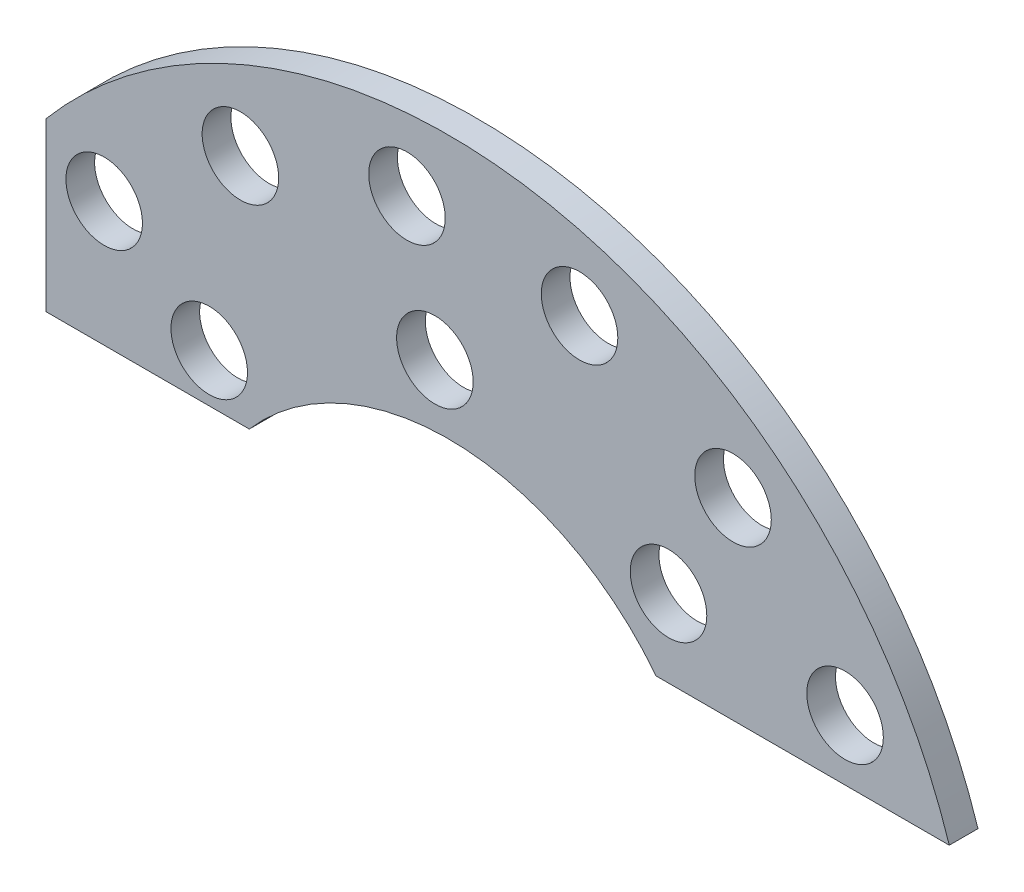
ISO-10303-21;
HEADER;
FILE_DESCRIPTION(('STEP AP214'),'2;1');
FILE_NAME('part.step','',(''),(''),'','','');
FILE_SCHEMA(('AUTOMOTIVE_DESIGN { 1 0 10303 214 1 1 1 1 }'));
ENDSEC;
DATA;
#1=APPLICATION_CONTEXT('core data for automotive mechanical design processes');
#2=APPLICATION_PROTOCOL_DEFINITION('international standard','automotive_design',2000,#1);
#3=PRODUCT_CONTEXT('',#1,'mechanical');
#4=PRODUCT('Part','Part','',(#3));
#5=PRODUCT_RELATED_PRODUCT_CATEGORY('part','',(#4));
#6=PRODUCT_DEFINITION_FORMATION('','',#4);
#7=PRODUCT_DEFINITION_CONTEXT('part definition',#1,'design');
#8=PRODUCT_DEFINITION('design','',#6,#7);
#9=PRODUCT_DEFINITION_SHAPE('','',#8);
#10=(LENGTH_UNIT() NAMED_UNIT(*) SI_UNIT(.MILLI.,.METRE.));
#11=(NAMED_UNIT(*) PLANE_ANGLE_UNIT() SI_UNIT($,.RADIAN.));
#12=(NAMED_UNIT(*) SI_UNIT($,.STERADIAN.) SOLID_ANGLE_UNIT());
#13=UNCERTAINTY_MEASURE_WITH_UNIT(LENGTH_MEASURE(1.E-05),#10,'distance_accuracy_value','');
#14=(GEOMETRIC_REPRESENTATION_CONTEXT(3) GLOBAL_UNCERTAINTY_ASSIGNED_CONTEXT((#13)) GLOBAL_UNIT_ASSIGNED_CONTEXT((#10,
#11,#12)) REPRESENTATION_CONTEXT('',''));
#15=CARTESIAN_POINT('',(0.,0.,0.));
#16=DIRECTION('',(0.,0.,1.));
#17=DIRECTION('',(1.,0.,0.));
#18=AXIS2_PLACEMENT_3D('',#15,#16,#17);
#19=CARTESIAN_POINT('',(-29.4571439349625,-2.39394581853957,32.6705448354942));
#20=DIRECTION('',(0.,0.,-1.));
#21=DIRECTION('',(-1.,0.,0.));
#22=AXIS2_PLACEMENT_3D('',#19,#20,#21);
#23=CYLINDRICAL_SURFACE('',#22,55.);
#24=CARTESIAN_POINT('',(-29.4571439349625,-2.39394581853957,29.6705448354942));
#25=DIRECTION('',(0.,0.,1.));
#26=DIRECTION('',(1.,0.,0.));
#27=AXIS2_PLACEMENT_3D('',#24,#25,#26);
#28=CIRCLE('',#27,55.);
#29=CARTESIAN_POINT('',(22.8855014317691,14.4953252140591,29.6705448354942));
#30=VERTEX_POINT('',#29);
#31=CARTESIAN_POINT('',(-71.513826382424,33.0494662846056,29.6705448354942));
#32=VERTEX_POINT('',#31);
#33=EDGE_CURVE('E140',#30,#32,#28,.T.);
#34=ORIENTED_EDGE('',*,*,#33,.T.);
#35=DIRECTION('',(0.,0.,-1.));
#36=VECTOR('',#35,1.);
#37=CARTESIAN_POINT('',(-71.513826382424,33.0494662846056,32.6705448354942));
#38=LINE('',#37,#36);
#39=CARTESIAN_POINT('',(-71.513826382424,33.0494662846056,32.6705448354942));
#40=VERTEX_POINT('',#39);
#41=EDGE_CURVE('E11',#40,#32,#38,.T.);
#42=ORIENTED_EDGE('',*,*,#41,.F.);
#43=CARTESIAN_POINT('',(-29.4571439349625,-2.39394581853957,32.6705448354942));
#44=DIRECTION('',(0.,0.,1.));
#45=DIRECTION('',(1.,0.,0.));
#46=AXIS2_PLACEMENT_3D('',#43,#44,#45);
#47=CIRCLE('',#46,55.);
#48=CARTESIAN_POINT('',(22.8855014317691,14.4953252140591,32.6705448354942));
#49=VERTEX_POINT('',#48);
#50=EDGE_CURVE('E170',#49,#40,#47,.T.);
#51=ORIENTED_EDGE('',*,*,#50,.F.);
#52=DIRECTION('',(0.,0.,-1.));
#53=VECTOR('',#52,1.);
#54=CARTESIAN_POINT('',(22.8855014317691,14.4953252140591,32.6705448354942));
#55=LINE('',#54,#53);
#56=EDGE_CURVE('E124',#49,#30,#55,.T.);
#57=ORIENTED_EDGE('',*,*,#56,.T.);
#58=EDGE_LOOP('',(#34,#42,#51,#57));
#59=FACE_BOUND('',#58,.T.);
#60=ADVANCED_FACE('F38',(#59),#23,.T.);
#61=CARTESIAN_POINT('',(-71.5138263824241,0.,32.6705448354942));
#62=DIRECTION('',(1.,0.,0.));
#63=DIRECTION('',(0.,1.,0.));
#64=AXIS2_PLACEMENT_3D('',#61,#62,#63);
#65=PLANE('',#64);
#66=DIRECTION('',(0.,-1.,0.));
#67=VECTOR('',#66,1.);
#68=CARTESIAN_POINT('',(-71.5138263824241,0.,29.6705448354942));
#69=LINE('',#68,#67);
#70=CARTESIAN_POINT('',(-71.5138263824241,15.5821797722919,29.6705448354942));
#71=VERTEX_POINT('',#70);
#72=EDGE_CURVE('E143',#32,#71,#69,.T.);
#73=ORIENTED_EDGE('',*,*,#72,.T.);
#74=DIRECTION('',(0.,0.,-1.));
#75=VECTOR('',#74,1.);
#76=CARTESIAN_POINT('',(-71.5138263824241,15.5821797722919,32.6705448354942));
#77=LINE('',#76,#75);
#78=CARTESIAN_POINT('',(-71.5138263824241,15.5821797722919,32.6705448354942));
#79=VERTEX_POINT('',#78);
#80=EDGE_CURVE('E47',#79,#71,#77,.T.);
#81=ORIENTED_EDGE('',*,*,#80,.F.);
#82=DIRECTION('',(0.,-1.,0.));
#83=VECTOR('',#82,1.);
#84=CARTESIAN_POINT('',(-71.5138263824241,0.,32.6705448354942));
#85=LINE('',#84,#83);
#86=EDGE_CURVE('E85',#40,#79,#85,.T.);
#87=ORIENTED_EDGE('',*,*,#86,.F.);
#88=ORIENTED_EDGE('',*,*,#41,.T.);
#89=EDGE_LOOP('',(#73,#81,#87,#88));
#90=FACE_BOUND('',#89,.T.);
#91=ADVANCED_FACE('F188',(#90),#65,.F.);
#92=CARTESIAN_POINT('',(0.,15.5821797722919,32.6705448354942));
#93=DIRECTION('',(0.,1.,0.));
#94=DIRECTION('',(0.,0.,1.));
#95=AXIS2_PLACEMENT_3D('',#92,#93,#94);
#96=PLANE('',#95);
#97=DIRECTION('',(1.,0.,0.));
#98=VECTOR('',#97,1.);
#99=CARTESIAN_POINT('',(0.,15.5821797722919,29.6705448354942));
#100=LINE('',#99,#98);
#101=CARTESIAN_POINT('',(-50.2684127271975,15.5821797722919,29.6705448354942));
#102=VERTEX_POINT('',#101);
#103=EDGE_CURVE('E102',#71,#102,#100,.T.);
#104=ORIENTED_EDGE('',*,*,#103,.T.);
#105=DIRECTION('',(0.,0.,-1.));
#106=VECTOR('',#105,1.);
#107=CARTESIAN_POINT('',(-50.2684127271975,15.5821797722919,32.6705448354942));
#108=LINE('',#107,#106);
#109=CARTESIAN_POINT('',(-50.2684127271975,15.5821797722919,32.6705448354942));
#110=VERTEX_POINT('',#109);
#111=EDGE_CURVE('E99',#110,#102,#108,.T.);
#112=ORIENTED_EDGE('',*,*,#111,.F.);
#113=DIRECTION('',(1.,0.,0.));
#114=VECTOR('',#113,1.);
#115=CARTESIAN_POINT('',(0.,15.5821797722919,32.6705448354942));
#116=LINE('',#115,#114);
#117=EDGE_CURVE('E89',#79,#110,#116,.T.);
#118=ORIENTED_EDGE('',*,*,#117,.F.);
#119=ORIENTED_EDGE('',*,*,#80,.T.);
#120=EDGE_LOOP('',(#104,#112,#118,#119));
#121=FACE_BOUND('',#120,.T.);
#122=ADVANCED_FACE('F100',(#121),#96,.F.);
#123=CARTESIAN_POINT('',(-29.4571439349625,-2.39394581853957,32.6705448354942));
#124=DIRECTION('',(0.,0.,-1.));
#125=DIRECTION('',(-1.,0.,0.));
#126=AXIS2_PLACEMENT_3D('',#123,#124,#125);
#127=CYLINDRICAL_SURFACE('',#126,27.5);
#128=CARTESIAN_POINT('',(-29.4571439349625,-2.39394581853957,29.6705448354942));
#129=DIRECTION('',(0.,0.,1.));
#130=DIRECTION('',(1.,0.,0.));
#131=AXIS2_PLACEMENT_3D('',#128,#129,#130);
#132=CIRCLE('',#131,27.5);
#133=CARTESIAN_POINT('',(-7.75455137122888,14.4953252140591,29.6705448354942));
#134=VERTEX_POINT('',#133);
#135=EDGE_CURVE('E146',#134,#102,#132,.T.);
#136=ORIENTED_EDGE('',*,*,#135,.F.);
#137=DIRECTION('',(0.,0.,-1.));
#138=VECTOR('',#137,1.);
#139=CARTESIAN_POINT('',(-7.75455137122888,14.4953252140591,32.6705448354942));
#140=LINE('',#139,#138);
#141=CARTESIAN_POINT('',(-7.75455137122888,14.4953252140591,32.6705448354942));
#142=VERTEX_POINT('',#141);
#143=EDGE_CURVE('E74',#142,#134,#140,.T.);
#144=ORIENTED_EDGE('',*,*,#143,.F.);
#145=CARTESIAN_POINT('',(-29.4571439349625,-2.39394581853957,32.6705448354942));
#146=DIRECTION('',(0.,0.,1.));
#147=DIRECTION('',(1.,0.,0.));
#148=AXIS2_PLACEMENT_3D('',#145,#146,#147);
#149=CIRCLE('',#148,27.5);
#150=EDGE_CURVE('E94',#142,#110,#149,.T.);
#151=ORIENTED_EDGE('',*,*,#150,.T.);
#152=ORIENTED_EDGE('',*,*,#111,.T.);
#153=EDGE_LOOP('',(#136,#144,#151,#152));
#154=FACE_BOUND('',#153,.T.);
#155=ADVANCED_FACE('F107',(#154),#127,.F.);
#156=CARTESIAN_POINT('',(-54.4571439349625,20.6060541814604,32.6705448354942));
#157=DIRECTION('',(0.,0.,-1.));
#158=DIRECTION('',(-1.,0.,0.));
#159=AXIS2_PLACEMENT_3D('',#156,#157,#158);
#160=CYLINDRICAL_SURFACE('',#159,4.);
#161=CARTESIAN_POINT('',(-54.4571439349625,20.6060541814604,32.6705448354942));
#162=DIRECTION('',(0.,0.,1.));
#163=DIRECTION('',(1.,0.,0.));
#164=AXIS2_PLACEMENT_3D('',#161,#162,#163);
#165=CIRCLE('',#164,4.);
#166=CARTESIAN_POINT('',(-50.4571439349625,20.6060541814604,32.6705448354942));
#167=VERTEX_POINT('',#166);
#168=EDGE_CURVE('E118',#167,#167,#165,.F.);
#169=ORIENTED_EDGE('',*,*,#168,.F.);
#170=EDGE_LOOP('',(#169));
#171=FACE_BOUND('',#170,.T.);
#172=CARTESIAN_POINT('',(-54.4571439349625,20.6060541814604,29.6705448354942));
#173=DIRECTION('',(0.,0.,1.));
#174=DIRECTION('',(1.,0.,0.));
#175=AXIS2_PLACEMENT_3D('',#172,#173,#174);
#176=CIRCLE('',#175,4.);
#177=CARTESIAN_POINT('',(-50.4571439349625,20.6060541814604,29.6705448354942));
#178=VERTEX_POINT('',#177);
#179=EDGE_CURVE('E155',#178,#178,#176,.F.);
#180=ORIENTED_EDGE('',*,*,#179,.T.);
#181=EDGE_LOOP('',(#180));
#182=FACE_BOUND('',#181,.T.);
#183=ADVANCED_FACE('F237',(#171,#182),#160,.F.);
#184=CARTESIAN_POINT('',(-6.45714393496269,22.6060541814659,32.6705448354942));
#185=DIRECTION('',(0.,0.,-1.));
#186=DIRECTION('',(-1.,0.,0.));
#187=AXIS2_PLACEMENT_3D('',#184,#185,#186);
#188=CYLINDRICAL_SURFACE('',#187,4.00000000000168);
#189=CARTESIAN_POINT('',(-6.45714393496269,22.6060541814659,32.6705448354942));
#190=DIRECTION('',(0.,0.,1.));
#191=DIRECTION('',(1.,0.,0.));
#192=AXIS2_PLACEMENT_3D('',#189,#190,#191);
#193=CIRCLE('',#192,4.00000000000168);
#194=CARTESIAN_POINT('',(-2.45714393496101,22.6060541814659,32.6705448354942));
#195=VERTEX_POINT('',#194);
#196=EDGE_CURVE('E115',#195,#195,#193,.F.);
#197=ORIENTED_EDGE('',*,*,#196,.F.);
#198=EDGE_LOOP('',(#197));
#199=FACE_BOUND('',#198,.T.);
#200=CARTESIAN_POINT('',(-6.45714393496269,22.6060541814659,29.6705448354942));
#201=DIRECTION('',(0.,0.,1.));
#202=DIRECTION('',(1.,0.,0.));
#203=AXIS2_PLACEMENT_3D('',#200,#201,#202);
#204=CIRCLE('',#203,4.00000000000168);
#205=CARTESIAN_POINT('',(-2.45714393496101,22.6060541814659,29.6705448354942));
#206=VERTEX_POINT('',#205);
#207=EDGE_CURVE('E152',#206,#206,#204,.F.);
#208=ORIENTED_EDGE('',*,*,#207,.T.);
#209=EDGE_LOOP('',(#208));
#210=FACE_BOUND('',#209,.T.);
#211=ADVANCED_FACE('F183',(#199,#210),#188,.F.);
#212=CARTESIAN_POINT('',(11.9923578085517,20.8049508193425,32.6705448354942));
#213=DIRECTION('',(0.,0.,-1.));
#214=DIRECTION('',(-1.,0.,0.));
#215=AXIS2_PLACEMENT_3D('',#212,#213,#214);
#216=CYLINDRICAL_SURFACE('',#215,4.00000000000001);
#217=CARTESIAN_POINT('',(11.9923578085517,20.8049508193425,32.6705448354942));
#218=DIRECTION('',(0.,0.,1.));
#219=DIRECTION('',(1.,0.,0.));
#220=AXIS2_PLACEMENT_3D('',#217,#218,#219);
#221=CIRCLE('',#220,4.00000000000001);
#222=CARTESIAN_POINT('',(15.9923578085517,20.8049508193425,32.6705448354942));
#223=VERTEX_POINT('',#222);
#224=EDGE_CURVE('E109',#223,#223,#221,.T.);
#225=ORIENTED_EDGE('',*,*,#224,.T.);
#226=EDGE_LOOP('',(#225));
#227=FACE_BOUND('',#226,.T.);
#228=CARTESIAN_POINT('',(11.9923578085517,20.8049508193425,29.6705448354942));
#229=DIRECTION('',(0.,0.,1.));
#230=DIRECTION('',(1.,0.,0.));
#231=AXIS2_PLACEMENT_3D('',#228,#229,#230);
#232=CIRCLE('',#231,4.00000000000001);
#233=CARTESIAN_POINT('',(15.9923578085517,20.8049508193425,29.6705448354942));
#234=VERTEX_POINT('',#233);
#235=EDGE_CURVE('E149',#234,#234,#232,.T.);
#236=ORIENTED_EDGE('',*,*,#235,.F.);
#237=EDGE_LOOP('',(#236));
#238=FACE_BOUND('',#237,.T.);
#239=ADVANCED_FACE('F174',(#227,#238),#216,.F.);
#240=CARTESIAN_POINT('',(0.,14.4953252140591,32.6705448354942));
#241=DIRECTION('',(0.,1.,0.));
#242=DIRECTION('',(0.,0.,1.));
#243=AXIS2_PLACEMENT_3D('',#240,#241,#242);
#244=PLANE('',#243);
#245=DIRECTION('',(1.,0.,0.));
#246=VECTOR('',#245,1.);
#247=CARTESIAN_POINT('',(0.,14.4953252140591,29.6705448354942));
#248=LINE('',#247,#246);
#249=EDGE_CURVE('E77',#134,#30,#248,.T.);
#250=ORIENTED_EDGE('',*,*,#249,.T.);
#251=ORIENTED_EDGE('',*,*,#56,.F.);
#252=DIRECTION('',(1.,0.,0.));
#253=VECTOR('',#252,1.);
#254=CARTESIAN_POINT('',(0.,14.4953252140591,32.6705448354942));
#255=LINE('',#254,#253);
#256=EDGE_CURVE('E55',#142,#49,#255,.T.);
#257=ORIENTED_EDGE('',*,*,#256,.F.);
#258=ORIENTED_EDGE('',*,*,#143,.T.);
#259=EDGE_LOOP('',(#250,#251,#257,#258));
#260=FACE_BOUND('',#259,.T.);
#261=ADVANCED_FACE('F171',(#260),#244,.F.);
#262=CARTESIAN_POINT('',(-65.4335404430369,28.6213551520106,32.6705448354942));
#263=DIRECTION('',(0.,0.,-1.));
#264=DIRECTION('',(-1.,0.,0.));
#265=AXIS2_PLACEMENT_3D('',#262,#263,#264);
#266=CYLINDRICAL_SURFACE('',#265,4.00000000000001);
#267=CARTESIAN_POINT('',(-65.4335404430369,28.6213551520106,32.6705448354942));
#268=DIRECTION('',(0.,0.,1.));
#269=DIRECTION('',(1.,0.,0.));
#270=AXIS2_PLACEMENT_3D('',#267,#268,#269);
#271=CIRCLE('',#270,4.00000000000001);
#272=CARTESIAN_POINT('',(-61.4335404430369,28.6213551520106,32.6705448354942));
#273=VERTEX_POINT('',#272);
#274=EDGE_CURVE('E385',#273,#273,#271,.T.);
#275=ORIENTED_EDGE('',*,*,#274,.T.);
#276=EDGE_LOOP('',(#275));
#277=FACE_BOUND('',#276,.T.);
#278=CARTESIAN_POINT('',(-65.4335404430369,28.6213551520106,29.6705448354942));
#279=DIRECTION('',(0.,0.,1.));
#280=DIRECTION('',(1.,0.,0.));
#281=AXIS2_PLACEMENT_3D('',#278,#279,#280);
#282=CIRCLE('',#281,4.00000000000001);
#283=CARTESIAN_POINT('',(-61.4335404430369,28.6213551520106,29.6705448354942));
#284=VERTEX_POINT('',#283);
#285=EDGE_CURVE('E137',#284,#284,#282,.T.);
#286=ORIENTED_EDGE('',*,*,#285,.F.);
#287=EDGE_LOOP('',(#286));
#288=FACE_BOUND('',#287,.T.);
#289=ADVANCED_FACE('F173',(#277,#288),#266,.F.);
#290=CARTESIAN_POINT('',(-51.1953416823968,39.8399358251565,32.6705448354942));
#291=DIRECTION('',(0.,0.,-1.));
#292=DIRECTION('',(-1.,0.,0.));
#293=AXIS2_PLACEMENT_3D('',#290,#291,#292);
#294=CYLINDRICAL_SURFACE('',#293,3.99999999999999);
#295=CARTESIAN_POINT('',(-51.1953416823968,39.8399358251565,32.6705448354942));
#296=DIRECTION('',(0.,0.,1.));
#297=DIRECTION('',(1.,0.,0.));
#298=AXIS2_PLACEMENT_3D('',#295,#296,#297);
#299=CIRCLE('',#298,3.99999999999999);
#300=CARTESIAN_POINT('',(-47.1953416823968,39.8399358251565,32.6705448354942));
#301=VERTEX_POINT('',#300);
#302=EDGE_CURVE('E382',#301,#301,#299,.T.);
#303=ORIENTED_EDGE('',*,*,#302,.T.);
#304=EDGE_LOOP('',(#303));
#305=FACE_BOUND('',#304,.T.);
#306=CARTESIAN_POINT('',(-51.1953416823968,39.8399358251565,29.6705448354942));
#307=DIRECTION('',(0.,0.,1.));
#308=DIRECTION('',(1.,0.,0.));
#309=AXIS2_PLACEMENT_3D('',#306,#307,#308);
#310=CIRCLE('',#309,3.99999999999999);
#311=CARTESIAN_POINT('',(-47.1953416823968,39.8399358251565,29.6705448354942));
#312=VERTEX_POINT('',#311);
#313=EDGE_CURVE('E134',#312,#312,#310,.T.);
#314=ORIENTED_EDGE('',*,*,#313,.F.);
#315=EDGE_LOOP('',(#314));
#316=FACE_BOUND('',#315,.T.);
#317=ADVANCED_FACE('F180',(#305,#316),#294,.F.);
#318=CARTESIAN_POINT('',(-33.7913593844898,44.9078995623503,32.6705448354942));
#319=DIRECTION('',(0.,0.,-1.));
#320=DIRECTION('',(-1.,0.,0.));
#321=AXIS2_PLACEMENT_3D('',#318,#319,#320);
#322=CYLINDRICAL_SURFACE('',#321,4.00000000000001);
#323=CARTESIAN_POINT('',(-33.7913593844898,44.9078995623503,32.6705448354942));
#324=DIRECTION('',(0.,0.,1.));
#325=DIRECTION('',(1.,0.,0.));
#326=AXIS2_PLACEMENT_3D('',#323,#324,#325);
#327=CIRCLE('',#326,4.00000000000001);
#328=CARTESIAN_POINT('',(-29.7913593844898,44.9078995623503,32.6705448354942));
#329=VERTEX_POINT('',#328);
#330=EDGE_CURVE('E378',#329,#329,#327,.T.);
#331=ORIENTED_EDGE('',*,*,#330,.T.);
#332=EDGE_LOOP('',(#331));
#333=FACE_BOUND('',#332,.T.);
#334=CARTESIAN_POINT('',(-33.7913593844898,44.9078995623503,29.6705448354942));
#335=DIRECTION('',(0.,0.,1.));
#336=DIRECTION('',(1.,0.,0.));
#337=AXIS2_PLACEMENT_3D('',#334,#335,#336);
#338=CIRCLE('',#337,4.00000000000001);
#339=CARTESIAN_POINT('',(-29.7913593844898,44.9078995623503,29.6705448354942));
#340=VERTEX_POINT('',#339);
#341=EDGE_CURVE('E131',#340,#340,#338,.T.);
#342=ORIENTED_EDGE('',*,*,#341,.F.);
#343=EDGE_LOOP('',(#342));
#344=FACE_BOUND('',#343,.T.);
#345=ADVANCED_FACE('F198',(#333,#344),#322,.F.);
#346=CARTESIAN_POINT('',(-15.7561753615586,43.0871871945165,32.6705448354942));
#347=DIRECTION('',(0.,0.,-1.));
#348=DIRECTION('',(-1.,0.,0.));
#349=AXIS2_PLACEMENT_3D('',#346,#347,#348);
#350=CYLINDRICAL_SURFACE('',#349,4.00000000000001);
#351=CARTESIAN_POINT('',(-15.7561753615586,43.0871871945165,32.6705448354942));
#352=DIRECTION('',(0.,0.,1.));
#353=DIRECTION('',(1.,0.,0.));
#354=AXIS2_PLACEMENT_3D('',#351,#352,#353);
#355=CIRCLE('',#354,4.00000000000001);
#356=CARTESIAN_POINT('',(-11.7561753615586,43.0871871945165,32.6705448354942));
#357=VERTEX_POINT('',#356);
#358=EDGE_CURVE('E213',#357,#357,#355,.T.);
#359=ORIENTED_EDGE('',*,*,#358,.T.);
#360=EDGE_LOOP('',(#359));
#361=FACE_BOUND('',#360,.T.);
#362=CARTESIAN_POINT('',(-15.7561753615586,43.0871871945165,29.6705448354942));
#363=DIRECTION('',(0.,0.,1.));
#364=DIRECTION('',(1.,0.,0.));
#365=AXIS2_PLACEMENT_3D('',#362,#363,#364);
#366=CIRCLE('',#365,4.00000000000001);
#367=CARTESIAN_POINT('',(-11.7561753615586,43.0871871945165,29.6705448354942));
#368=VERTEX_POINT('',#367);
#369=EDGE_CURVE('E128',#368,#368,#366,.T.);
#370=ORIENTED_EDGE('',*,*,#369,.F.);
#371=EDGE_LOOP('',(#370));
#372=FACE_BOUND('',#371,.T.);
#373=ADVANCED_FACE('F201',(#361,#372),#350,.F.);
#374=CARTESIAN_POINT('',(0.283705220939567,34.6429532347917,32.6705448354942));
#375=DIRECTION('',(0.,0.,-1.));
#376=DIRECTION('',(-1.,0.,0.));
#377=AXIS2_PLACEMENT_3D('',#374,#375,#376);
#378=CYLINDRICAL_SURFACE('',#377,4.00000000000001);
#379=CARTESIAN_POINT('',(0.283705220939567,34.6429532347917,32.6705448354942));
#380=DIRECTION('',(0.,0.,1.));
#381=DIRECTION('',(1.,0.,0.));
#382=AXIS2_PLACEMENT_3D('',#379,#380,#381);
#383=CIRCLE('',#382,4.00000000000001);
#384=CARTESIAN_POINT('',(4.28370522093958,34.6429532347917,32.6705448354942));
#385=VERTEX_POINT('',#384);
#386=EDGE_CURVE('E161',#385,#385,#383,.T.);
#387=ORIENTED_EDGE('',*,*,#386,.T.);
#388=EDGE_LOOP('',(#387));
#389=FACE_BOUND('',#388,.T.);
#390=CARTESIAN_POINT('',(0.283705220939567,34.6429532347917,29.6705448354942));
#391=DIRECTION('',(0.,0.,1.));
#392=DIRECTION('',(1.,0.,0.));
#393=AXIS2_PLACEMENT_3D('',#390,#391,#392);
#394=CIRCLE('',#393,4.00000000000001);
#395=CARTESIAN_POINT('',(4.28370522093958,34.6429532347917,29.6705448354942));
#396=VERTEX_POINT('',#395);
#397=EDGE_CURVE('E125',#396,#396,#394,.T.);
#398=ORIENTED_EDGE('',*,*,#397,.F.);
#399=EDGE_LOOP('',(#398));
#400=FACE_BOUND('',#399,.T.);
#401=ADVANCED_FACE('F40',(#389,#400),#378,.F.);
#402=CARTESIAN_POINT('',(-30.8713574973368,31.5471796784174,32.6705448354942));
#403=DIRECTION('',(0.,0.,-1.));
#404=DIRECTION('',(-1.,0.,0.));
#405=AXIS2_PLACEMENT_3D('',#402,#403,#404);
#406=CYLINDRICAL_SURFACE('',#405,3.99999999999996);
#407=CARTESIAN_POINT('',(-30.8713574973368,31.5471796784174,32.6705448354942));
#408=DIRECTION('',(0.,0.,1.));
#409=DIRECTION('',(1.,0.,0.));
#410=AXIS2_PLACEMENT_3D('',#407,#408,#409);
#411=CIRCLE('',#410,3.99999999999996);
#412=CARTESIAN_POINT('',(-26.8713574973368,31.5471796784174,32.6705448354942));
#413=VERTEX_POINT('',#412);
#414=EDGE_CURVE('E121',#413,#413,#411,.F.);
#415=ORIENTED_EDGE('',*,*,#414,.F.);
#416=EDGE_LOOP('',(#415));
#417=FACE_BOUND('',#416,.T.);
#418=CARTESIAN_POINT('',(-30.8713574973368,31.5471796784174,29.6705448354942));
#419=DIRECTION('',(0.,0.,1.));
#420=DIRECTION('',(1.,0.,0.));
#421=AXIS2_PLACEMENT_3D('',#418,#419,#420);
#422=CIRCLE('',#421,3.99999999999996);
#423=CARTESIAN_POINT('',(-26.8713574973368,31.5471796784174,29.6705448354942));
#424=VERTEX_POINT('',#423);
#425=EDGE_CURVE('E158',#424,#424,#422,.F.);
#426=ORIENTED_EDGE('',*,*,#425,.T.);
#427=EDGE_LOOP('',(#426));
#428=FACE_BOUND('',#427,.T.);
#429=ADVANCED_FACE('F208',(#417,#428),#406,.F.);
#430=CARTESIAN_POINT('',(0.,0.,32.6705448354942));
#431=DIRECTION('',(0.,0.,1.));
#432=DIRECTION('',(1.,0.,0.));
#433=AXIS2_PLACEMENT_3D('',#430,#431,#432);
#434=PLANE('',#433);
#435=ORIENTED_EDGE('',*,*,#386,.F.);
#436=EDGE_LOOP('',(#435));
#437=FACE_BOUND('',#436,.T.);
#438=ORIENTED_EDGE('',*,*,#358,.F.);
#439=EDGE_LOOP('',(#438));
#440=FACE_BOUND('',#439,.T.);
#441=ORIENTED_EDGE('',*,*,#330,.F.);
#442=EDGE_LOOP('',(#441));
#443=FACE_BOUND('',#442,.T.);
#444=ORIENTED_EDGE('',*,*,#302,.F.);
#445=EDGE_LOOP('',(#444));
#446=FACE_BOUND('',#445,.T.);
#447=ORIENTED_EDGE('',*,*,#274,.F.);
#448=EDGE_LOOP('',(#447));
#449=FACE_BOUND('',#448,.T.);
#450=ORIENTED_EDGE('',*,*,#50,.T.);
#451=ORIENTED_EDGE('',*,*,#86,.T.);
#452=ORIENTED_EDGE('',*,*,#117,.T.);
#453=ORIENTED_EDGE('',*,*,#150,.F.);
#454=ORIENTED_EDGE('',*,*,#256,.T.);
#455=EDGE_LOOP('',(#450,#451,#452,#453,#454));
#456=FACE_BOUND('',#455,.T.);
#457=ORIENTED_EDGE('',*,*,#224,.F.);
#458=EDGE_LOOP('',(#457));
#459=FACE_BOUND('',#458,.T.);
#460=ORIENTED_EDGE('',*,*,#196,.T.);
#461=EDGE_LOOP('',(#460));
#462=FACE_BOUND('',#461,.T.);
#463=ORIENTED_EDGE('',*,*,#168,.T.);
#464=EDGE_LOOP('',(#463));
#465=FACE_BOUND('',#464,.T.);
#466=ORIENTED_EDGE('',*,*,#414,.T.);
#467=EDGE_LOOP('',(#466));
#468=FACE_BOUND('',#467,.T.);
#469=ADVANCED_FACE('F91',(#437,#440,#443,#446,#449,#456,#459,#462,#465,#468),#434,.T.);
#470=CARTESIAN_POINT('',(0.,0.,29.6705448354942));
#471=DIRECTION('',(0.,0.,1.));
#472=DIRECTION('',(1.,0.,0.));
#473=AXIS2_PLACEMENT_3D('',#470,#471,#472);
#474=PLANE('',#473);
#475=ORIENTED_EDGE('',*,*,#397,.T.);
#476=EDGE_LOOP('',(#475));
#477=FACE_BOUND('',#476,.T.);
#478=ORIENTED_EDGE('',*,*,#369,.T.);
#479=EDGE_LOOP('',(#478));
#480=FACE_BOUND('',#479,.T.);
#481=ORIENTED_EDGE('',*,*,#341,.T.);
#482=EDGE_LOOP('',(#481));
#483=FACE_BOUND('',#482,.T.);
#484=ORIENTED_EDGE('',*,*,#313,.T.);
#485=EDGE_LOOP('',(#484));
#486=FACE_BOUND('',#485,.T.);
#487=ORIENTED_EDGE('',*,*,#285,.T.);
#488=EDGE_LOOP('',(#487));
#489=FACE_BOUND('',#488,.T.);
#490=ORIENTED_EDGE('',*,*,#33,.F.);
#491=ORIENTED_EDGE('',*,*,#249,.F.);
#492=ORIENTED_EDGE('',*,*,#135,.T.);
#493=ORIENTED_EDGE('',*,*,#103,.F.);
#494=ORIENTED_EDGE('',*,*,#72,.F.);
#495=EDGE_LOOP('',(#490,#491,#492,#493,#494));
#496=FACE_BOUND('',#495,.T.);
#497=ORIENTED_EDGE('',*,*,#235,.T.);
#498=EDGE_LOOP('',(#497));
#499=FACE_BOUND('',#498,.T.);
#500=ORIENTED_EDGE('',*,*,#207,.F.);
#501=EDGE_LOOP('',(#500));
#502=FACE_BOUND('',#501,.T.);
#503=ORIENTED_EDGE('',*,*,#179,.F.);
#504=EDGE_LOOP('',(#503));
#505=FACE_BOUND('',#504,.T.);
#506=ORIENTED_EDGE('',*,*,#425,.F.);
#507=EDGE_LOOP('',(#506));
#508=FACE_BOUND('',#507,.T.);
#509=ADVANCED_FACE('F165',(#477,#480,#483,#486,#489,#496,#499,#502,#505,#508),#474,.F.);
#510=CLOSED_SHELL('',(#60,#91,#122,#155,#183,#211,#239,#261,#289,#317,#345,#373,#401,#429,#469,#509));
#511=MANIFOLD_SOLID_BREP('B2',#510);
#512=ADVANCED_BREP_SHAPE_REPRESENTATION('',(#18,#511),#14);
#513=SHAPE_DEFINITION_REPRESENTATION(#9,#512);
ENDSEC;
END-ISO-10303-21;
